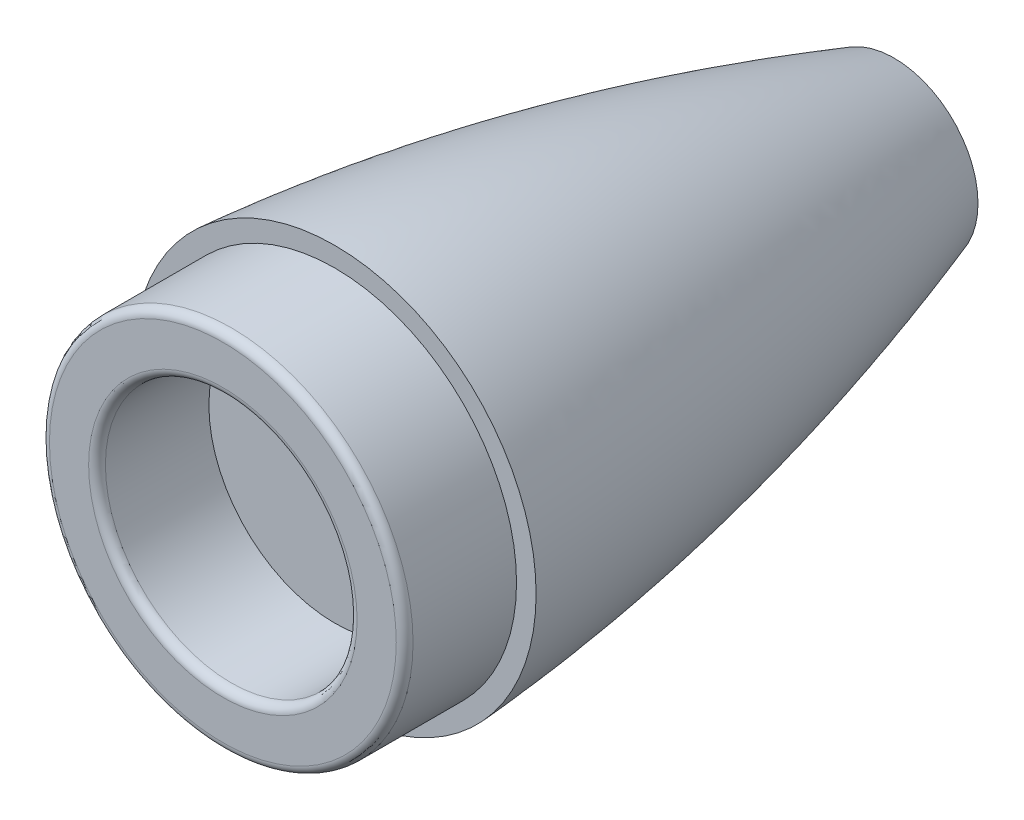
ISO-10303-21;
HEADER;
FILE_DESCRIPTION(('STEP AP214'),'2;1');
FILE_NAME('part.step','',(''),(''),'','','');
FILE_SCHEMA(('AUTOMOTIVE_DESIGN { 1 0 10303 214 1 1 1 1 }'));
ENDSEC;
DATA;
#1=APPLICATION_CONTEXT('core data for automotive mechanical design processes');
#2=APPLICATION_PROTOCOL_DEFINITION('international standard','automotive_design',2000,#1);
#3=PRODUCT_CONTEXT('',#1,'mechanical');
#4=PRODUCT('Part','Part','',(#3));
#5=PRODUCT_RELATED_PRODUCT_CATEGORY('part','',(#4));
#6=PRODUCT_DEFINITION_FORMATION('','',#4);
#7=PRODUCT_DEFINITION_CONTEXT('part definition',#1,'design');
#8=PRODUCT_DEFINITION('design','',#6,#7);
#9=PRODUCT_DEFINITION_SHAPE('','',#8);
#10=(LENGTH_UNIT() NAMED_UNIT(*) SI_UNIT(.MILLI.,.METRE.));
#11=(NAMED_UNIT(*) PLANE_ANGLE_UNIT() SI_UNIT($,.RADIAN.));
#12=(NAMED_UNIT(*) SI_UNIT($,.STERADIAN.) SOLID_ANGLE_UNIT());
#13=UNCERTAINTY_MEASURE_WITH_UNIT(LENGTH_MEASURE(1.E-05),#10,'distance_accuracy_value','');
#14=(GEOMETRIC_REPRESENTATION_CONTEXT(3) GLOBAL_UNCERTAINTY_ASSIGNED_CONTEXT((#13)) GLOBAL_UNIT_ASSIGNED_CONTEXT((#10,
#11,#12)) REPRESENTATION_CONTEXT('',''));
#15=CARTESIAN_POINT('',(0.,0.,0.));
#16=DIRECTION('',(0.,0.,1.));
#17=DIRECTION('',(1.,0.,0.));
#18=AXIS2_PLACEMENT_3D('',#15,#16,#17);
#19=CARTESIAN_POINT('',(0.,0.,-40.));
#20=DIRECTION('',(0.,0.,1.));
#21=DIRECTION('',(1.,0.,0.));
#22=AXIS2_PLACEMENT_3D('',#19,#20,#21);
#23=CYLINDRICAL_SURFACE('',#22,65.);
#24=CARTESIAN_POINT('',(0.,0.,-3.));
#25=DIRECTION('',(0.,0.,1.));
#26=DIRECTION('',(1.,0.,0.));
#27=AXIS2_PLACEMENT_3D('',#24,#25,#26);
#28=CIRCLE('',#27,65.);
#29=CARTESIAN_POINT('',(65.,0.,-3.));
#30=VERTEX_POINT('',#29);
#31=EDGE_CURVE('E10',#30,#30,#28,.F.);
#32=ORIENTED_EDGE('',*,*,#31,.T.);
#33=EDGE_LOOP('',(#32));
#34=FACE_BOUND('',#33,.T.);
#35=CARTESIAN_POINT('',(0.,0.,-40.));
#36=DIRECTION('',(0.,0.,-1.));
#37=DIRECTION('',(-1.,0.,0.));
#38=AXIS2_PLACEMENT_3D('',#35,#36,#37);
#39=CIRCLE('',#38,65.);
#40=CARTESIAN_POINT('',(-65.,0.,-40.));
#41=VERTEX_POINT('',#40);
#42=EDGE_CURVE('E53',#41,#41,#39,.F.);
#43=ORIENTED_EDGE('',*,*,#42,.T.);
#44=EDGE_LOOP('',(#43));
#45=FACE_BOUND('',#44,.T.);
#46=ADVANCED_FACE('F30',(#34,#45),#23,.T.);
#47=CARTESIAN_POINT('',(0.,0.,0.));
#48=DIRECTION('',(0.,0.,1.));
#49=DIRECTION('',(1.,0.,0.));
#50=AXIS2_PLACEMENT_3D('',#47,#48,#49);
#51=PLANE('',#50);
#52=CARTESIAN_POINT('',(0.,0.,0.));
#53=DIRECTION('',(0.,0.,1.));
#54=DIRECTION('',(1.,0.,0.));
#55=AXIS2_PLACEMENT_3D('',#52,#53,#54);
#56=CIRCLE('',#55,48.);
#57=CARTESIAN_POINT('',(48.,0.,0.));
#58=VERTEX_POINT('',#57);
#59=EDGE_CURVE('E37',#58,#58,#56,.F.);
#60=ORIENTED_EDGE('',*,*,#59,.T.);
#61=EDGE_LOOP('',(#60));
#62=FACE_BOUND('',#61,.T.);
#63=CARTESIAN_POINT('',(0.,0.,0.));
#64=DIRECTION('',(0.,0.,1.));
#65=DIRECTION('',(1.,0.,0.));
#66=AXIS2_PLACEMENT_3D('',#63,#64,#65);
#67=CIRCLE('',#66,62.);
#68=CARTESIAN_POINT('',(62.,0.,0.));
#69=VERTEX_POINT('',#68);
#70=EDGE_CURVE('E41',#69,#69,#67,.T.);
#71=ORIENTED_EDGE('',*,*,#70,.T.);
#72=EDGE_LOOP('',(#71));
#73=FACE_BOUND('',#72,.T.);
#74=ADVANCED_FACE('F93',(#62,#73),#51,.T.);
#75=CARTESIAN_POINT('',(0.,0.,-40.));
#76=DIRECTION('',(0.,0.,1.));
#77=DIRECTION('',(1.,0.,0.));
#78=AXIS2_PLACEMENT_3D('',#75,#76,#77);
#79=CYLINDRICAL_SURFACE('',#78,45.);
#80=CARTESIAN_POINT('',(0.,0.,-3.));
#81=DIRECTION('',(0.,0.,1.));
#82=DIRECTION('',(1.,0.,0.));
#83=AXIS2_PLACEMENT_3D('',#80,#81,#82);
#84=CIRCLE('',#83,45.);
#85=CARTESIAN_POINT('',(45.,0.,-3.));
#86=VERTEX_POINT('',#85);
#87=EDGE_CURVE('E45',#86,#86,#84,.T.);
#88=ORIENTED_EDGE('',*,*,#87,.T.);
#89=EDGE_LOOP('',(#88));
#90=FACE_BOUND('',#89,.T.);
#91=CARTESIAN_POINT('',(0.,0.,-40.));
#92=DIRECTION('',(0.,0.,1.));
#93=DIRECTION('',(1.,0.,0.));
#94=AXIS2_PLACEMENT_3D('',#91,#92,#93);
#95=CIRCLE('',#94,45.);
#96=CARTESIAN_POINT('',(45.,0.,-40.));
#97=VERTEX_POINT('',#96);
#98=EDGE_CURVE('E50',#97,#97,#95,.T.);
#99=ORIENTED_EDGE('',*,*,#98,.F.);
#100=EDGE_LOOP('',(#99));
#101=FACE_BOUND('',#100,.T.);
#102=ADVANCED_FACE('F89',(#90,#101),#79,.F.);
#103=CARTESIAN_POINT('',(0.,0.,-3.));
#104=DIRECTION('',(0.,0.,1.));
#105=DIRECTION('',(1.,0.,0.));
#106=AXIS2_PLACEMENT_3D('',#103,#104,#105);
#107=TOROIDAL_SURFACE('',#106,48.,3.);
#108=ORIENTED_EDGE('',*,*,#59,.F.);
#109=EDGE_LOOP('',(#108));
#110=FACE_BOUND('',#109,.T.);
#111=ORIENTED_EDGE('',*,*,#87,.F.);
#112=EDGE_LOOP('',(#111));
#113=FACE_BOUND('',#112,.T.);
#114=ADVANCED_FACE('F92',(#110,#113),#107,.T.);
#115=CARTESIAN_POINT('',(0.,0.,-3.));
#116=DIRECTION('',(0.,0.,1.));
#117=DIRECTION('',(1.,0.,0.));
#118=AXIS2_PLACEMENT_3D('',#115,#116,#117);
#119=TOROIDAL_SURFACE('',#118,62.,3.);
#120=ORIENTED_EDGE('',*,*,#31,.F.);
#121=EDGE_LOOP('',(#120));
#122=FACE_BOUND('',#121,.T.);
#123=ORIENTED_EDGE('',*,*,#70,.F.);
#124=EDGE_LOOP('',(#123));
#125=FACE_BOUND('',#124,.T.);
#126=ADVANCED_FACE('F32',(#122,#125),#119,.T.);
#127=CARTESIAN_POINT('',(0.,0.,-40.));
#128=DIRECTION('',(0.,0.,-1.));
#129=DIRECTION('',(-1.,0.,0.));
#130=AXIS2_PLACEMENT_3D('',#127,#128,#129);
#131=PLANE('',#130);
#132=ORIENTED_EDGE('',*,*,#98,.T.);
#133=EDGE_LOOP('',(#132));
#134=FACE_BOUND('',#133,.T.);
#135=ADVANCED_FACE('F87',(#134),#131,.F.);
#136=ORIENTED_EDGE('',*,*,#42,.F.);
#137=EDGE_LOOP('',(#136));
#138=FACE_BOUND('',#137,.T.);
#139=CARTESIAN_POINT('',(0.,0.,-40.));
#140=DIRECTION('',(0.,0.,1.));
#141=DIRECTION('',(1.,0.,0.));
#142=AXIS2_PLACEMENT_3D('',#139,#140,#141);
#143=CIRCLE('',#142,72.);
#144=CARTESIAN_POINT('',(72.,0.,-40.));
#145=VERTEX_POINT('',#144);
#146=EDGE_CURVE('E59',#145,#145,#143,.T.);
#147=ORIENTED_EDGE('',*,*,#146,.T.);
#148=EDGE_LOOP('',(#147));
#149=FACE_BOUND('',#148,.T.);
#150=ADVANCED_FACE('F83',(#138,#149),#131,.F.);
#151=CARTESIAN_POINT('',(0.,0.,-240.));
#152=DIRECTION('',(0.,0.,1.));
#153=DIRECTION('',(1.,0.,0.));
#154=AXIS2_PLACEMENT_3D('',#151,#152,#153);
#155=PLANE('',#154);
#156=CARTESIAN_POINT('',(0.,0.,-240.));
#157=DIRECTION('',(0.,0.,-1.));
#158=DIRECTION('',(-1.,0.,0.));
#159=AXIS2_PLACEMENT_3D('',#156,#157,#158);
#160=CIRCLE('',#159,10.);
#161=CARTESIAN_POINT('',(-10.,0.,-240.));
#162=VERTEX_POINT('',#161);
#163=EDGE_CURVE('E67',#162,#162,#160,.T.);
#164=ORIENTED_EDGE('',*,*,#163,.F.);
#165=EDGE_LOOP('',(#164));
#166=FACE_BOUND('',#165,.T.);
#167=CARTESIAN_POINT('',(0.,0.,-240.));
#168=DIRECTION('',(0.,0.,1.));
#169=DIRECTION('',(1.,0.,0.));
#170=AXIS2_PLACEMENT_3D('',#167,#168,#169);
#171=CIRCLE('',#170,30.);
#172=CARTESIAN_POINT('',(30.,0.,-240.));
#173=VERTEX_POINT('',#172);
#174=EDGE_CURVE('E56',#173,#173,#171,.T.);
#175=ORIENTED_EDGE('',*,*,#174,.F.);
#176=EDGE_LOOP('',(#175));
#177=FACE_BOUND('',#176,.T.);
#178=ADVANCED_FACE('F78',(#166,#177),#155,.F.);
#179=CARTESIAN_POINT('',(0.,29.9999999999999,-240.));
#180=CARTESIAN_POINT('',(0.,64.8545088634664,-137.597263883536));
#181=CARTESIAN_POINT('',(0.,72.,-40.));
#182=B_SPLINE_CURVE_WITH_KNOTS('',2,(#179,#180,#181),.UNSPECIFIED.,.F.,.F.,(3,3),(0.,1.),.UNSPECIFIED.);
#183=CARTESIAN_POINT('',(0.,0.,-40.));
#184=DIRECTION('',(0.,0.,1.));
#185=AXIS1_PLACEMENT('',#183,#184);
#186=SURFACE_OF_REVOLUTION('',#182,#185);
#187=ORIENTED_EDGE('',*,*,#146,.F.);
#188=EDGE_LOOP('',(#187));
#189=FACE_BOUND('',#188,.T.);
#190=ORIENTED_EDGE('',*,*,#174,.T.);
#191=EDGE_LOOP('',(#190));
#192=FACE_BOUND('',#191,.T.);
#193=ADVANCED_FACE('F73',(#189,#192),#186,.T.);
#194=CARTESIAN_POINT('',(0.,0.,-220.));
#195=DIRECTION('',(0.,0.,-1.));
#196=DIRECTION('',(-1.,0.,0.));
#197=AXIS2_PLACEMENT_3D('',#194,#195,#196);
#198=CYLINDRICAL_SURFACE('',#197,10.);
#199=CARTESIAN_POINT('',(0.,0.,-220.));
#200=DIRECTION('',(0.,0.,-1.));
#201=DIRECTION('',(-1.,0.,0.));
#202=AXIS2_PLACEMENT_3D('',#199,#200,#201);
#203=CIRCLE('',#202,10.);
#204=CARTESIAN_POINT('',(-10.,0.,-220.));
#205=VERTEX_POINT('',#204);
#206=EDGE_CURVE('E62',#205,#205,#203,.T.);
#207=ORIENTED_EDGE('',*,*,#206,.F.);
#208=EDGE_LOOP('',(#207));
#209=FACE_BOUND('',#208,.T.);
#210=ORIENTED_EDGE('',*,*,#163,.T.);
#211=EDGE_LOOP('',(#210));
#212=FACE_BOUND('',#211,.T.);
#213=ADVANCED_FACE('F77',(#209,#212),#198,.F.);
#214=CARTESIAN_POINT('',(0.,0.,-220.));
#215=DIRECTION('',(0.,0.,-1.));
#216=DIRECTION('',(-1.,0.,0.));
#217=AXIS2_PLACEMENT_3D('',#214,#215,#216);
#218=PLANE('',#217);
#219=ORIENTED_EDGE('',*,*,#206,.T.);
#220=EDGE_LOOP('',(#219));
#221=FACE_BOUND('',#220,.T.);
#222=ADVANCED_FACE('F132',(#221),#218,.T.);
#223=CLOSED_SHELL('',(#46,#74,#102,#114,#126,#135,#150,#178,#193,#213,#222));
#224=MANIFOLD_SOLID_BREP('B2',#223);
#225=ADVANCED_BREP_SHAPE_REPRESENTATION('',(#18,#224),#14);
#226=SHAPE_DEFINITION_REPRESENTATION(#9,#225);
ENDSEC;
END-ISO-10303-21;
